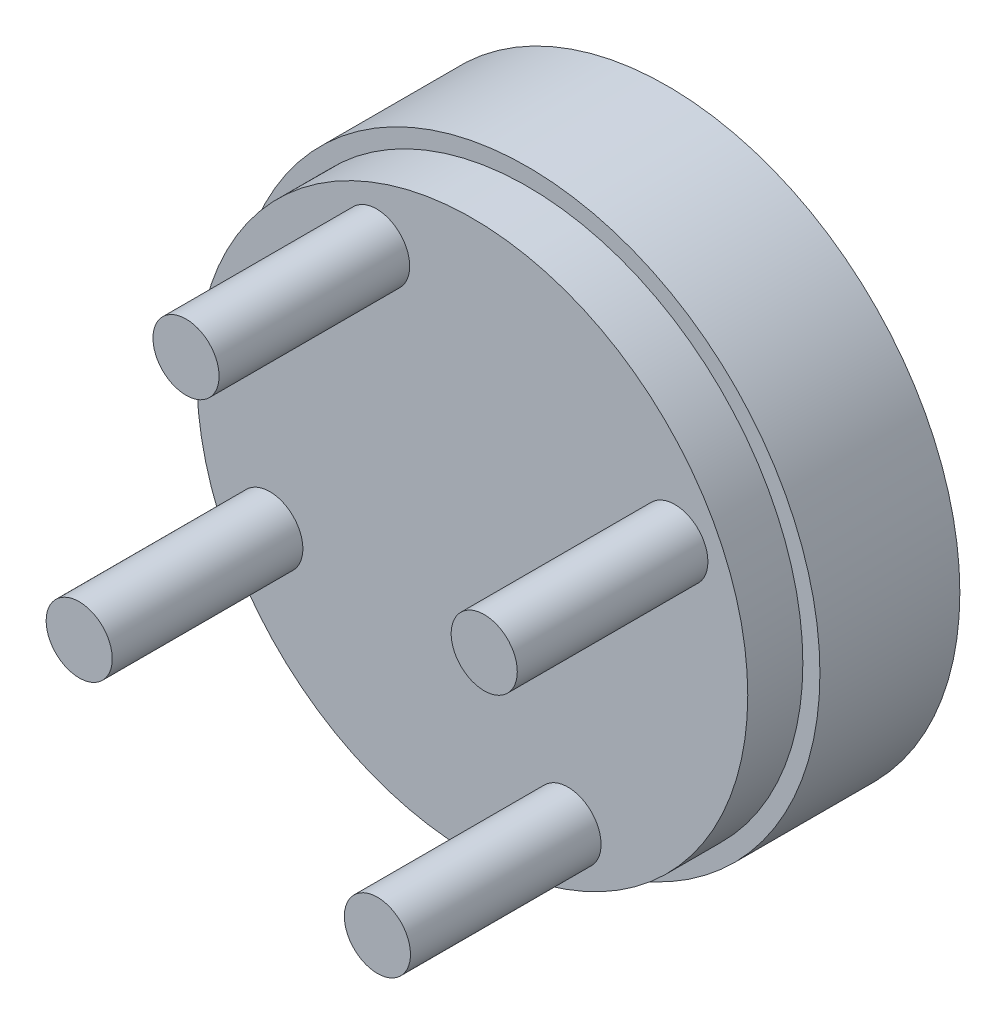
ISO-10303-21;
HEADER;
FILE_DESCRIPTION(('STEP AP214'),'2;1');
FILE_NAME('part.step','',(''),(''),'','','');
FILE_SCHEMA(('AUTOMOTIVE_DESIGN { 1 0 10303 214 1 1 1 1 }'));
ENDSEC;
DATA;
#1=APPLICATION_CONTEXT('core data for automotive mechanical design processes');
#2=APPLICATION_PROTOCOL_DEFINITION('international standard','automotive_design',2000,#1);
#3=PRODUCT_CONTEXT('',#1,'mechanical');
#4=PRODUCT('Part','Part','',(#3));
#5=PRODUCT_RELATED_PRODUCT_CATEGORY('part','',(#4));
#6=PRODUCT_DEFINITION_FORMATION('','',#4);
#7=PRODUCT_DEFINITION_CONTEXT('part definition',#1,'design');
#8=PRODUCT_DEFINITION('design','',#6,#7);
#9=PRODUCT_DEFINITION_SHAPE('','',#8);
#10=(LENGTH_UNIT() NAMED_UNIT(*) SI_UNIT(.MILLI.,.METRE.));
#11=(NAMED_UNIT(*) PLANE_ANGLE_UNIT() SI_UNIT($,.RADIAN.));
#12=(NAMED_UNIT(*) SI_UNIT($,.STERADIAN.) SOLID_ANGLE_UNIT());
#13=UNCERTAINTY_MEASURE_WITH_UNIT(LENGTH_MEASURE(1.E-05),#10,'distance_accuracy_value','');
#14=(GEOMETRIC_REPRESENTATION_CONTEXT(3) GLOBAL_UNCERTAINTY_ASSIGNED_CONTEXT((#13)) GLOBAL_UNIT_ASSIGNED_CONTEXT((#10,
#11,#12)) REPRESENTATION_CONTEXT('',''));
#15=CARTESIAN_POINT('',(0.,0.,0.));
#16=DIRECTION('',(0.,0.,1.));
#17=DIRECTION('',(1.,0.,0.));
#18=AXIS2_PLACEMENT_3D('',#15,#16,#17);
#19=CARTESIAN_POINT('',(0.,0.,25.4));
#20=DIRECTION('',(0.,0.,-1.));
#21=DIRECTION('',(-1.,0.,0.));
#22=AXIS2_PLACEMENT_3D('',#19,#20,#21);
#23=CYLINDRICAL_SURFACE('',#22,53.1);
#24=CARTESIAN_POINT('',(0.,0.,25.4));
#25=DIRECTION('',(0.,0.,1.));
#26=DIRECTION('',(1.,0.,0.));
#27=AXIS2_PLACEMENT_3D('',#24,#25,#26);
#28=CIRCLE('',#27,53.1);
#29=CARTESIAN_POINT('',(53.1,0.,25.4));
#30=VERTEX_POINT('',#29);
#31=EDGE_CURVE('E47',#30,#30,#28,.T.);
#32=ORIENTED_EDGE('',*,*,#31,.F.);
#33=EDGE_LOOP('',(#32));
#34=FACE_BOUND('',#33,.T.);
#35=CARTESIAN_POINT('',(0.,0.,0.));
#36=DIRECTION('',(0.,0.,1.));
#37=DIRECTION('',(1.,0.,0.));
#38=AXIS2_PLACEMENT_3D('',#35,#36,#37);
#39=CIRCLE('',#38,53.1);
#40=CARTESIAN_POINT('',(53.1,0.,0.));
#41=VERTEX_POINT('',#40);
#42=EDGE_CURVE('E42',#41,#41,#39,.T.);
#43=ORIENTED_EDGE('',*,*,#42,.T.);
#44=EDGE_LOOP('',(#43));
#45=FACE_BOUND('',#44,.T.);
#46=ADVANCED_FACE('F39',(#34,#45),#23,.T.);
#47=CARTESIAN_POINT('',(0.,0.,25.4));
#48=DIRECTION('',(0.,0.,1.));
#49=DIRECTION('',(1.,0.,0.));
#50=AXIS2_PLACEMENT_3D('',#47,#48,#49);
#51=PLANE('',#50);
#52=CARTESIAN_POINT('',(0.,0.,25.4));
#53=DIRECTION('',(0.,0.,1.));
#54=DIRECTION('',(1.,0.,0.));
#55=AXIS2_PLACEMENT_3D('',#52,#53,#54);
#56=CIRCLE('',#55,50.);
#57=CARTESIAN_POINT('',(50.,0.,25.4));
#58=VERTEX_POINT('',#57);
#59=EDGE_CURVE('E10',#58,#58,#56,.T.);
#60=ORIENTED_EDGE('',*,*,#59,.F.);
#61=EDGE_LOOP('',(#60));
#62=FACE_BOUND('',#61,.T.);
#63=ORIENTED_EDGE('',*,*,#31,.T.);
#64=EDGE_LOOP('',(#63));
#65=FACE_BOUND('',#64,.T.);
#66=ADVANCED_FACE('F120',(#62,#65),#51,.T.);
#67=CARTESIAN_POINT('',(0.,0.,0.));
#68=DIRECTION('',(0.,0.,1.));
#69=DIRECTION('',(1.,0.,0.));
#70=AXIS2_PLACEMENT_3D('',#67,#68,#69);
#71=PLANE('',#70);
#72=ORIENTED_EDGE('',*,*,#42,.F.);
#73=EDGE_LOOP('',(#72));
#74=FACE_BOUND('',#73,.T.);
#75=ADVANCED_FACE('F115',(#74),#71,.F.);
#76=CARTESIAN_POINT('',(0.,0.,35.4));
#77=DIRECTION('',(0.,0.,-1.));
#78=DIRECTION('',(-1.,0.,0.));
#79=AXIS2_PLACEMENT_3D('',#76,#77,#78);
#80=CYLINDRICAL_SURFACE('',#79,50.);
#81=CARTESIAN_POINT('',(0.,0.,35.4));
#82=DIRECTION('',(0.,0.,1.));
#83=DIRECTION('',(1.,0.,0.));
#84=AXIS2_PLACEMENT_3D('',#81,#82,#83);
#85=CIRCLE('',#84,50.);
#86=CARTESIAN_POINT('',(50.,0.,35.4));
#87=VERTEX_POINT('',#86);
#88=EDGE_CURVE('E54',#87,#87,#85,.T.);
#89=ORIENTED_EDGE('',*,*,#88,.F.);
#90=EDGE_LOOP('',(#89));
#91=FACE_BOUND('',#90,.T.);
#92=ORIENTED_EDGE('',*,*,#59,.T.);
#93=EDGE_LOOP('',(#92));
#94=FACE_BOUND('',#93,.T.);
#95=ADVANCED_FACE('F104',(#91,#94),#80,.T.);
#96=CARTESIAN_POINT('',(0.,0.,35.4));
#97=DIRECTION('',(0.,0.,1.));
#98=DIRECTION('',(1.,0.,0.));
#99=AXIS2_PLACEMENT_3D('',#96,#97,#98);
#100=PLANE('',#99);
#101=CARTESIAN_POINT('',(-17.3699025194218,36.7630532799682,35.4));
#102=DIRECTION('',(0.,0.,1.));
#103=DIRECTION('',(0.,1.,0.));
#104=AXIS2_PLACEMENT_3D('',#101,#102,#103);
#105=CIRCLE('',#104,6.);
#106=CARTESIAN_POINT('',(-17.3699025194217,42.7630532799682,35.4));
#107=VERTEX_POINT('',#106);
#108=EDGE_CURVE('E83',#107,#107,#105,.T.);
#109=ORIENTED_EDGE('',*,*,#108,.F.);
#110=EDGE_LOOP('',(#109));
#111=FACE_BOUND('',#110,.T.);
#112=CARTESIAN_POINT('',(-36.7630532799681,-17.3699025194222,35.4));
#113=DIRECTION('',(0.,0.,1.));
#114=DIRECTION('',(-1.,0.,0.));
#115=AXIS2_PLACEMENT_3D('',#112,#113,#114);
#116=CIRCLE('',#115,6.);
#117=CARTESIAN_POINT('',(-42.7630532799681,-17.3699025194222,35.4));
#118=VERTEX_POINT('',#117);
#119=EDGE_CURVE('E75',#118,#118,#116,.T.);
#120=ORIENTED_EDGE('',*,*,#119,.F.);
#121=EDGE_LOOP('',(#120));
#122=FACE_BOUND('',#121,.T.);
#123=CARTESIAN_POINT('',(17.3699025194221,-36.7630532799681,35.4));
#124=DIRECTION('',(0.,0.,1.));
#125=DIRECTION('',(0.,-1.,0.));
#126=AXIS2_PLACEMENT_3D('',#123,#124,#125);
#127=CIRCLE('',#126,6.);
#128=CARTESIAN_POINT('',(17.369902519422,-42.7630532799681,35.4));
#129=VERTEX_POINT('',#128);
#130=EDGE_CURVE('E67',#129,#129,#127,.T.);
#131=ORIENTED_EDGE('',*,*,#130,.F.);
#132=EDGE_LOOP('',(#131));
#133=FACE_BOUND('',#132,.T.);
#134=CARTESIAN_POINT('',(36.7630532799681,17.3699025194222,35.4));
#135=DIRECTION('',(0.,0.,1.));
#136=DIRECTION('',(1.,0.,0.));
#137=AXIS2_PLACEMENT_3D('',#134,#135,#136);
#138=CIRCLE('',#137,6.);
#139=CARTESIAN_POINT('',(42.7630532799681,17.3699025194222,35.4));
#140=VERTEX_POINT('',#139);
#141=EDGE_CURVE('E59',#140,#140,#138,.T.);
#142=ORIENTED_EDGE('',*,*,#141,.F.);
#143=EDGE_LOOP('',(#142));
#144=FACE_BOUND('',#143,.T.);
#145=ORIENTED_EDGE('',*,*,#88,.T.);
#146=EDGE_LOOP('',(#145));
#147=FACE_BOUND('',#146,.T.);
#148=ADVANCED_FACE('F100',(#111,#122,#133,#144,#147),#100,.T.);
#149=CARTESIAN_POINT('',(36.7630532799681,17.3699025194222,70.));
#150=DIRECTION('',(0.,0.,-1.));
#151=DIRECTION('',(-1.,0.,0.));
#152=AXIS2_PLACEMENT_3D('',#149,#150,#151);
#153=CYLINDRICAL_SURFACE('',#152,6.);
#154=CARTESIAN_POINT('',(36.7630532799681,17.3699025194222,70.));
#155=DIRECTION('',(0.,0.,1.));
#156=DIRECTION('',(1.,0.,0.));
#157=AXIS2_PLACEMENT_3D('',#154,#155,#156);
#158=CIRCLE('',#157,6.);
#159=CARTESIAN_POINT('',(42.7630532799681,17.3699025194222,70.));
#160=VERTEX_POINT('',#159);
#161=EDGE_CURVE('E58',#160,#160,#158,.T.);
#162=ORIENTED_EDGE('',*,*,#161,.F.);
#163=EDGE_LOOP('',(#162));
#164=FACE_BOUND('',#163,.T.);
#165=ORIENTED_EDGE('',*,*,#141,.T.);
#166=EDGE_LOOP('',(#165));
#167=FACE_BOUND('',#166,.T.);
#168=ADVANCED_FACE('F103',(#164,#167),#153,.T.);
#169=CARTESIAN_POINT('',(36.7630532799681,17.3699025194222,70.));
#170=DIRECTION('',(0.,0.,1.));
#171=DIRECTION('',(1.,0.,0.));
#172=AXIS2_PLACEMENT_3D('',#169,#170,#171);
#173=PLANE('',#172);
#174=ORIENTED_EDGE('',*,*,#161,.T.);
#175=EDGE_LOOP('',(#174));
#176=FACE_BOUND('',#175,.T.);
#177=ADVANCED_FACE('F169',(#176),#173,.T.);
#178=CARTESIAN_POINT('',(17.3699025194221,-36.7630532799681,70.));
#179=DIRECTION('',(0.,0.,-1.));
#180=DIRECTION('',(-1.,0.,0.));
#181=AXIS2_PLACEMENT_3D('',#178,#179,#180);
#182=CYLINDRICAL_SURFACE('',#181,6.);
#183=CARTESIAN_POINT('',(17.3699025194221,-36.7630532799681,70.));
#184=DIRECTION('',(0.,0.,1.));
#185=DIRECTION('',(0.,-1.,0.));
#186=AXIS2_PLACEMENT_3D('',#183,#184,#185);
#187=CIRCLE('',#186,6.);
#188=CARTESIAN_POINT('',(17.369902519422,-42.7630532799681,70.));
#189=VERTEX_POINT('',#188);
#190=EDGE_CURVE('E63',#189,#189,#187,.T.);
#191=ORIENTED_EDGE('',*,*,#190,.F.);
#192=EDGE_LOOP('',(#191));
#193=FACE_BOUND('',#192,.T.);
#194=ORIENTED_EDGE('',*,*,#130,.T.);
#195=EDGE_LOOP('',(#194));
#196=FACE_BOUND('',#195,.T.);
#197=ADVANCED_FACE('F177',(#193,#196),#182,.T.);
#198=CARTESIAN_POINT('',(17.3699025194221,-36.7630532799681,70.));
#199=DIRECTION('',(0.,0.,1.));
#200=DIRECTION('',(0.,-1.,0.));
#201=AXIS2_PLACEMENT_3D('',#198,#199,#200);
#202=PLANE('',#201);
#203=ORIENTED_EDGE('',*,*,#190,.T.);
#204=EDGE_LOOP('',(#203));
#205=FACE_BOUND('',#204,.T.);
#206=ADVANCED_FACE('F185',(#205),#202,.T.);
#207=CARTESIAN_POINT('',(-36.7630532799681,-17.3699025194222,70.));
#208=DIRECTION('',(0.,0.,-1.));
#209=DIRECTION('',(-1.,0.,0.));
#210=AXIS2_PLACEMENT_3D('',#207,#208,#209);
#211=CYLINDRICAL_SURFACE('',#210,6.);
#212=CARTESIAN_POINT('',(-36.7630532799681,-17.3699025194222,70.));
#213=DIRECTION('',(0.,0.,1.));
#214=DIRECTION('',(-1.,0.,0.));
#215=AXIS2_PLACEMENT_3D('',#212,#213,#214);
#216=CIRCLE('',#215,6.);
#217=CARTESIAN_POINT('',(-42.7630532799681,-17.3699025194222,70.));
#218=VERTEX_POINT('',#217);
#219=EDGE_CURVE('E71',#218,#218,#216,.T.);
#220=ORIENTED_EDGE('',*,*,#219,.F.);
#221=EDGE_LOOP('',(#220));
#222=FACE_BOUND('',#221,.T.);
#223=ORIENTED_EDGE('',*,*,#119,.T.);
#224=EDGE_LOOP('',(#223));
#225=FACE_BOUND('',#224,.T.);
#226=ADVANCED_FACE('F194',(#222,#225),#211,.T.);
#227=CARTESIAN_POINT('',(-36.7630532799681,-17.3699025194222,70.));
#228=DIRECTION('',(0.,0.,1.));
#229=DIRECTION('',(-1.,0.,0.));
#230=AXIS2_PLACEMENT_3D('',#227,#228,#229);
#231=PLANE('',#230);
#232=ORIENTED_EDGE('',*,*,#219,.T.);
#233=EDGE_LOOP('',(#232));
#234=FACE_BOUND('',#233,.T.);
#235=ADVANCED_FACE('F96',(#234),#231,.T.);
#236=CARTESIAN_POINT('',(-17.3699025194218,36.7630532799682,70.));
#237=DIRECTION('',(0.,0.,-1.));
#238=DIRECTION('',(-1.,0.,0.));
#239=AXIS2_PLACEMENT_3D('',#236,#237,#238);
#240=CYLINDRICAL_SURFACE('',#239,6.);
#241=CARTESIAN_POINT('',(-17.3699025194218,36.7630532799682,70.));
#242=DIRECTION('',(0.,0.,1.));
#243=DIRECTION('',(0.,1.,0.));
#244=AXIS2_PLACEMENT_3D('',#241,#242,#243);
#245=CIRCLE('',#244,6.);
#246=CARTESIAN_POINT('',(-17.3699025194217,42.7630532799682,70.));
#247=VERTEX_POINT('',#246);
#248=EDGE_CURVE('E79',#247,#247,#245,.T.);
#249=ORIENTED_EDGE('',*,*,#248,.F.);
#250=EDGE_LOOP('',(#249));
#251=FACE_BOUND('',#250,.T.);
#252=ORIENTED_EDGE('',*,*,#108,.T.);
#253=EDGE_LOOP('',(#252));
#254=FACE_BOUND('',#253,.T.);
#255=ADVANCED_FACE('F93',(#251,#254),#240,.T.);
#256=CARTESIAN_POINT('',(-17.3699025194218,36.7630532799682,70.));
#257=DIRECTION('',(0.,0.,1.));
#258=DIRECTION('',(0.,1.,0.));
#259=AXIS2_PLACEMENT_3D('',#256,#257,#258);
#260=PLANE('',#259);
#261=ORIENTED_EDGE('',*,*,#248,.T.);
#262=EDGE_LOOP('',(#261));
#263=FACE_BOUND('',#262,.T.);
#264=ADVANCED_FACE('F91',(#263),#260,.T.);
#265=CLOSED_SHELL('',(#46,#66,#75,#95,#148,#168,#177,#197,#206,#226,#235,#255,#264));
#266=MANIFOLD_SOLID_BREP('B2',#265);
#267=ADVANCED_BREP_SHAPE_REPRESENTATION('',(#18,#266),#14);
#268=SHAPE_DEFINITION_REPRESENTATION(#9,#267);
ENDSEC;
END-ISO-10303-21;
